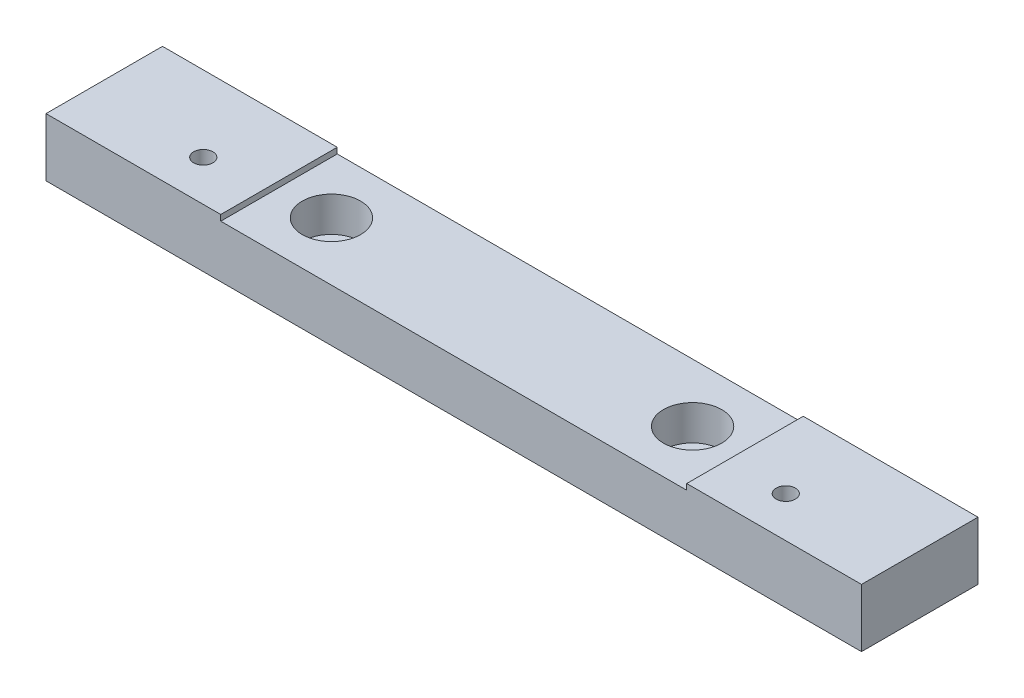
ISO-10303-21;
HEADER;
FILE_DESCRIPTION(('STEP AP214'),'2;1');
FILE_NAME('part.step','',(''),(''),'','','');
FILE_SCHEMA(('AUTOMOTIVE_DESIGN { 1 0 10303 214 1 1 1 1 }'));
ENDSEC;
DATA;
#1=APPLICATION_CONTEXT('core data for automotive mechanical design processes');
#2=APPLICATION_PROTOCOL_DEFINITION('international standard','automotive_design',2000,#1);
#3=PRODUCT_CONTEXT('',#1,'mechanical');
#4=PRODUCT('Part','Part','',(#3));
#5=PRODUCT_RELATED_PRODUCT_CATEGORY('part','',(#4));
#6=PRODUCT_DEFINITION_FORMATION('','',#4);
#7=PRODUCT_DEFINITION_CONTEXT('part definition',#1,'design');
#8=PRODUCT_DEFINITION('design','',#6,#7);
#9=PRODUCT_DEFINITION_SHAPE('','',#8);
#10=(LENGTH_UNIT() NAMED_UNIT(*) SI_UNIT(.MILLI.,.METRE.));
#11=(NAMED_UNIT(*) PLANE_ANGLE_UNIT() SI_UNIT($,.RADIAN.));
#12=(NAMED_UNIT(*) SI_UNIT($,.STERADIAN.) SOLID_ANGLE_UNIT());
#13=UNCERTAINTY_MEASURE_WITH_UNIT(LENGTH_MEASURE(1.E-05),#10,'distance_accuracy_value','');
#14=(GEOMETRIC_REPRESENTATION_CONTEXT(3) GLOBAL_UNCERTAINTY_ASSIGNED_CONTEXT((#13)) GLOBAL_UNIT_ASSIGNED_CONTEXT((#10,
#11,#12)) REPRESENTATION_CONTEXT('',''));
#15=CARTESIAN_POINT('',(0.,0.,0.));
#16=DIRECTION('',(0.,0.,1.));
#17=DIRECTION('',(1.,0.,0.));
#18=AXIS2_PLACEMENT_3D('',#15,#16,#17);
#19=CARTESIAN_POINT('',(-31.,0.,0.));
#20=DIRECTION('',(0.,1.,0.));
#21=DIRECTION('',(0.,0.,1.));
#22=AXIS2_PLACEMENT_3D('',#19,#20,#21);
#23=CYLINDRICAL_SURFACE('',#22,2.75);
#24=CARTESIAN_POINT('',(-31.,0.,0.));
#25=DIRECTION('',(0.,1.,0.));
#26=DIRECTION('',(0.,0.,1.));
#27=AXIS2_PLACEMENT_3D('',#24,#25,#26);
#28=CIRCLE('',#27,2.75);
#29=CARTESIAN_POINT('',(-31.,0.,2.75));
#30=VERTEX_POINT('',#29);
#31=EDGE_CURVE('E168',#30,#30,#28,.T.);
#32=ORIENTED_EDGE('',*,*,#31,.F.);
#33=EDGE_LOOP('',(#32));
#34=FACE_BOUND('',#33,.T.);
#35=CARTESIAN_POINT('',(-31.,3.,0.));
#36=DIRECTION('',(0.,1.,0.));
#37=DIRECTION('',(0.,0.,1.));
#38=AXIS2_PLACEMENT_3D('',#35,#36,#37);
#39=CIRCLE('',#38,2.75);
#40=CARTESIAN_POINT('',(-31.,3.,2.75));
#41=VERTEX_POINT('',#40);
#42=EDGE_CURVE('E37',#41,#41,#39,.F.);
#43=ORIENTED_EDGE('',*,*,#42,.F.);
#44=EDGE_LOOP('',(#43));
#45=FACE_BOUND('',#44,.T.);
#46=ADVANCED_FACE('F33',(#34,#45),#23,.F.);
#47=CARTESIAN_POINT('',(31.,0.,0.));
#48=DIRECTION('',(0.,1.,0.));
#49=DIRECTION('',(0.,0.,1.));
#50=AXIS2_PLACEMENT_3D('',#47,#48,#49);
#51=CYLINDRICAL_SURFACE('',#50,2.75);
#52=CARTESIAN_POINT('',(31.,0.,0.));
#53=DIRECTION('',(0.,1.,0.));
#54=DIRECTION('',(0.,0.,1.));
#55=AXIS2_PLACEMENT_3D('',#52,#53,#54);
#56=CIRCLE('',#55,2.75);
#57=CARTESIAN_POINT('',(31.,0.,2.75));
#58=VERTEX_POINT('',#57);
#59=EDGE_CURVE('E136',#58,#58,#56,.T.);
#60=ORIENTED_EDGE('',*,*,#59,.F.);
#61=EDGE_LOOP('',(#60));
#62=FACE_BOUND('',#61,.T.);
#63=CARTESIAN_POINT('',(31.,3.,0.));
#64=DIRECTION('',(0.,1.,0.));
#65=DIRECTION('',(0.,0.,1.));
#66=AXIS2_PLACEMENT_3D('',#63,#64,#65);
#67=CIRCLE('',#66,2.75);
#68=CARTESIAN_POINT('',(31.,3.,2.75));
#69=VERTEX_POINT('',#68);
#70=EDGE_CURVE('E166',#69,#69,#67,.F.);
#71=ORIENTED_EDGE('',*,*,#70,.F.);
#72=EDGE_LOOP('',(#71));
#73=FACE_BOUND('',#72,.T.);
#74=ADVANCED_FACE('F190',(#62,#73),#51,.F.);
#75=CARTESIAN_POINT('',(0.,10.,0.));
#76=DIRECTION('',(0.,1.,0.));
#77=DIRECTION('',(0.,0.,1.));
#78=AXIS2_PLACEMENT_3D('',#75,#76,#77);
#79=PLANE('',#78);
#80=CARTESIAN_POINT('',(-50.,10.,3.));
#81=DIRECTION('',(0.,1.,0.));
#82=DIRECTION('',(0.,0.,1.));
#83=AXIS2_PLACEMENT_3D('',#80,#81,#82);
#84=CIRCLE('',#83,1.65);
#85=CARTESIAN_POINT('',(-50.,10.,4.65));
#86=VERTEX_POINT('',#85);
#87=EDGE_CURVE('E378',#86,#86,#84,.T.);
#88=ORIENTED_EDGE('',*,*,#87,.F.);
#89=EDGE_LOOP('',(#88));
#90=FACE_BOUND('',#89,.T.);
#91=DIRECTION('',(0.,0.,1.));
#92=VECTOR('',#91,1.);
#93=CARTESIAN_POINT('',(-40.,10.,-10.));
#94=LINE('',#93,#92);
#95=CARTESIAN_POINT('',(-40.,10.,-10.));
#96=VERTEX_POINT('',#95);
#97=CARTESIAN_POINT('',(-40.,10.,10.));
#98=VERTEX_POINT('',#97);
#99=EDGE_CURVE('E114',#96,#98,#94,.T.);
#100=ORIENTED_EDGE('',*,*,#99,.F.);
#101=DIRECTION('',(-1.,0.,0.));
#102=VECTOR('',#101,1.);
#103=CARTESIAN_POINT('',(-70.,10.,-10.));
#104=LINE('',#103,#102);
#105=CARTESIAN_POINT('',(-70.,10.,-10.));
#106=VERTEX_POINT('',#105);
#107=EDGE_CURVE('E59',#96,#106,#104,.T.);
#108=ORIENTED_EDGE('',*,*,#107,.T.);
#109=DIRECTION('',(0.,0.,1.));
#110=VECTOR('',#109,1.);
#111=CARTESIAN_POINT('',(-70.,10.,-10.));
#112=LINE('',#111,#110);
#113=CARTESIAN_POINT('',(-70.,10.,10.));
#114=VERTEX_POINT('',#113);
#115=EDGE_CURVE('E145',#106,#114,#112,.T.);
#116=ORIENTED_EDGE('',*,*,#115,.T.);
#117=DIRECTION('',(1.,0.,0.));
#118=VECTOR('',#117,1.);
#119=CARTESIAN_POINT('',(-70.,10.,10.));
#120=LINE('',#119,#118);
#121=EDGE_CURVE('E88',#114,#98,#120,.T.);
#122=ORIENTED_EDGE('',*,*,#121,.T.);
#123=EDGE_LOOP('',(#100,#108,#116,#122));
#124=FACE_BOUND('',#123,.T.);
#125=ADVANCED_FACE('F193',(#90,#124),#79,.T.);
#126=CARTESIAN_POINT('',(-70.,10.,-10.));
#127=DIRECTION('',(1.,0.,0.));
#128=DIRECTION('',(0.,0.,-1.));
#129=AXIS2_PLACEMENT_3D('',#126,#127,#128);
#130=PLANE('',#129);
#131=DIRECTION('',(0.,0.,1.));
#132=VECTOR('',#131,1.);
#133=CARTESIAN_POINT('',(-70.,0.,-10.));
#134=LINE('',#133,#132);
#135=CARTESIAN_POINT('',(-70.,0.,-10.));
#136=VERTEX_POINT('',#135);
#137=CARTESIAN_POINT('',(-70.,0.,10.));
#138=VERTEX_POINT('',#137);
#139=EDGE_CURVE('E140',#136,#138,#134,.T.);
#140=ORIENTED_EDGE('',*,*,#139,.T.);
#141=DIRECTION('',(0.,-1.,0.));
#142=VECTOR('',#141,1.);
#143=CARTESIAN_POINT('',(-70.,10.,10.));
#144=LINE('',#143,#142);
#145=EDGE_CURVE('E11',#114,#138,#144,.T.);
#146=ORIENTED_EDGE('',*,*,#145,.F.);
#147=ORIENTED_EDGE('',*,*,#115,.F.);
#148=DIRECTION('',(0.,-1.,0.));
#149=VECTOR('',#148,1.);
#150=CARTESIAN_POINT('',(-70.,10.,-10.));
#151=LINE('',#150,#149);
#152=EDGE_CURVE('E154',#106,#136,#151,.T.);
#153=ORIENTED_EDGE('',*,*,#152,.T.);
#154=EDGE_LOOP('',(#140,#146,#147,#153));
#155=FACE_BOUND('',#154,.T.);
#156=ADVANCED_FACE('F35',(#155),#130,.F.);
#157=CARTESIAN_POINT('',(-70.,10.,10.));
#158=DIRECTION('',(0.,0.,-1.));
#159=DIRECTION('',(-1.,0.,0.));
#160=AXIS2_PLACEMENT_3D('',#157,#158,#159);
#161=PLANE('',#160);
#162=DIRECTION('',(1.,0.,0.));
#163=VECTOR('',#162,1.);
#164=CARTESIAN_POINT('',(-40.,9.,10.));
#165=LINE('',#164,#163);
#166=CARTESIAN_POINT('',(-40.,9.,10.));
#167=VERTEX_POINT('',#166);
#168=CARTESIAN_POINT('',(40.,9.,10.));
#169=VERTEX_POINT('',#168);
#170=EDGE_CURVE('E122',#167,#169,#165,.T.);
#171=ORIENTED_EDGE('',*,*,#170,.F.);
#172=DIRECTION('',(0.,1.,0.));
#173=VECTOR('',#172,1.);
#174=CARTESIAN_POINT('',(-40.,9.,10.));
#175=LINE('',#174,#173);
#176=EDGE_CURVE('E109',#167,#98,#175,.T.);
#177=ORIENTED_EDGE('',*,*,#176,.T.);
#178=ORIENTED_EDGE('',*,*,#121,.F.);
#179=ORIENTED_EDGE('',*,*,#145,.T.);
#180=DIRECTION('',(1.,0.,0.));
#181=VECTOR('',#180,1.);
#182=CARTESIAN_POINT('',(-70.,0.,10.));
#183=LINE('',#182,#181);
#184=CARTESIAN_POINT('',(70.,0.,10.));
#185=VERTEX_POINT('',#184);
#186=EDGE_CURVE('E157',#138,#185,#183,.T.);
#187=ORIENTED_EDGE('',*,*,#186,.T.);
#188=DIRECTION('',(0.,-1.,0.));
#189=VECTOR('',#188,1.);
#190=CARTESIAN_POINT('',(70.,10.,10.));
#191=LINE('',#190,#189);
#192=CARTESIAN_POINT('',(70.,10.,10.));
#193=VERTEX_POINT('',#192);
#194=EDGE_CURVE('E42',#193,#185,#191,.T.);
#195=ORIENTED_EDGE('',*,*,#194,.F.);
#196=CARTESIAN_POINT('',(40.,10.,10.));
#197=VERTEX_POINT('',#196);
#198=EDGE_CURVE('E147',#197,#193,#120,.T.);
#199=ORIENTED_EDGE('',*,*,#198,.F.);
#200=DIRECTION('',(0.,1.,0.));
#201=VECTOR('',#200,1.);
#202=CARTESIAN_POINT('',(40.,9.,10.));
#203=LINE('',#202,#201);
#204=EDGE_CURVE('E50',#169,#197,#203,.T.);
#205=ORIENTED_EDGE('',*,*,#204,.F.);
#206=EDGE_LOOP('',(#171,#177,#178,#179,#187,#195,#199,#205));
#207=FACE_BOUND('',#206,.T.);
#208=ADVANCED_FACE('F127',(#207),#161,.F.);
#209=CARTESIAN_POINT('',(70.,10.,-10.));
#210=DIRECTION('',(-1.,0.,0.));
#211=DIRECTION('',(0.,0.,1.));
#212=AXIS2_PLACEMENT_3D('',#209,#210,#211);
#213=PLANE('',#212);
#214=DIRECTION('',(0.,0.,-1.));
#215=VECTOR('',#214,1.);
#216=CARTESIAN_POINT('',(70.,0.,-10.));
#217=LINE('',#216,#215);
#218=CARTESIAN_POINT('',(70.,0.,-10.));
#219=VERTEX_POINT('',#218);
#220=EDGE_CURVE('E159',#185,#219,#217,.T.);
#221=ORIENTED_EDGE('',*,*,#220,.T.);
#222=DIRECTION('',(0.,-1.,0.));
#223=VECTOR('',#222,1.);
#224=CARTESIAN_POINT('',(70.,10.,-10.));
#225=LINE('',#224,#223);
#226=CARTESIAN_POINT('',(70.,10.,-10.));
#227=VERTEX_POINT('',#226);
#228=EDGE_CURVE('E163',#227,#219,#225,.T.);
#229=ORIENTED_EDGE('',*,*,#228,.F.);
#230=DIRECTION('',(0.,0.,-1.));
#231=VECTOR('',#230,1.);
#232=CARTESIAN_POINT('',(70.,10.,-10.));
#233=LINE('',#232,#231);
#234=EDGE_CURVE('E149',#193,#227,#233,.T.);
#235=ORIENTED_EDGE('',*,*,#234,.F.);
#236=ORIENTED_EDGE('',*,*,#194,.T.);
#237=EDGE_LOOP('',(#221,#229,#235,#236));
#238=FACE_BOUND('',#237,.T.);
#239=ADVANCED_FACE('F223',(#238),#213,.F.);
#240=CARTESIAN_POINT('',(-70.,10.,-10.));
#241=DIRECTION('',(0.,0.,1.));
#242=DIRECTION('',(1.,0.,0.));
#243=AXIS2_PLACEMENT_3D('',#240,#241,#242);
#244=PLANE('',#243);
#245=ORIENTED_EDGE('',*,*,#107,.F.);
#246=DIRECTION('',(0.,1.,0.));
#247=VECTOR('',#246,1.);
#248=CARTESIAN_POINT('',(-40.,9.,-10.));
#249=LINE('',#248,#247);
#250=CARTESIAN_POINT('',(-40.,9.,-10.));
#251=VERTEX_POINT('',#250);
#252=EDGE_CURVE('E138',#251,#96,#249,.T.);
#253=ORIENTED_EDGE('',*,*,#252,.F.);
#254=DIRECTION('',(-1.,0.,0.));
#255=VECTOR('',#254,1.);
#256=CARTESIAN_POINT('',(-40.,9.,-10.));
#257=LINE('',#256,#255);
#258=CARTESIAN_POINT('',(40.,9.,-10.));
#259=VERTEX_POINT('',#258);
#260=EDGE_CURVE('E116',#259,#251,#257,.T.);
#261=ORIENTED_EDGE('',*,*,#260,.F.);
#262=DIRECTION('',(0.,1.,0.));
#263=VECTOR('',#262,1.);
#264=CARTESIAN_POINT('',(40.,9.,-10.));
#265=LINE('',#264,#263);
#266=CARTESIAN_POINT('',(40.,10.,-10.));
#267=VERTEX_POINT('',#266);
#268=EDGE_CURVE('E141',#259,#267,#265,.T.);
#269=ORIENTED_EDGE('',*,*,#268,.T.);
#270=EDGE_CURVE('E151',#227,#267,#104,.T.);
#271=ORIENTED_EDGE('',*,*,#270,.F.);
#272=ORIENTED_EDGE('',*,*,#228,.T.);
#273=DIRECTION('',(-1.,0.,0.));
#274=VECTOR('',#273,1.);
#275=CARTESIAN_POINT('',(-70.,0.,-10.));
#276=LINE('',#275,#274);
#277=EDGE_CURVE('E81',#219,#136,#276,.T.);
#278=ORIENTED_EDGE('',*,*,#277,.T.);
#279=ORIENTED_EDGE('',*,*,#152,.F.);
#280=EDGE_LOOP('',(#245,#253,#261,#269,#271,#272,#278,#279));
#281=FACE_BOUND('',#280,.T.);
#282=ADVANCED_FACE('F216',(#281),#244,.F.);
#283=CARTESIAN_POINT('',(50.,10.,3.));
#284=DIRECTION('',(0.,1.,0.));
#285=DIRECTION('',(0.,0.,1.));
#286=AXIS2_PLACEMENT_3D('',#283,#284,#285);
#287=CIRCLE('',#286,1.65);
#288=CARTESIAN_POINT('',(50.,10.,4.65));
#289=VERTEX_POINT('',#288);
#290=EDGE_CURVE('E386',#289,#289,#287,.T.);
#291=ORIENTED_EDGE('',*,*,#290,.F.);
#292=EDGE_LOOP('',(#291));
#293=FACE_BOUND('',#292,.T.);
#294=DIRECTION('',(0.,0.,-1.));
#295=VECTOR('',#294,1.);
#296=CARTESIAN_POINT('',(40.,10.,-10.));
#297=LINE('',#296,#295);
#298=EDGE_CURVE('E125',#197,#267,#297,.T.);
#299=ORIENTED_EDGE('',*,*,#298,.F.);
#300=ORIENTED_EDGE('',*,*,#198,.T.);
#301=ORIENTED_EDGE('',*,*,#234,.T.);
#302=ORIENTED_EDGE('',*,*,#270,.T.);
#303=EDGE_LOOP('',(#299,#300,#301,#302));
#304=FACE_BOUND('',#303,.T.);
#305=ADVANCED_FACE('F201',(#293,#304),#79,.T.);
#306=CARTESIAN_POINT('',(0.,0.,0.));
#307=DIRECTION('',(0.,1.,0.));
#308=DIRECTION('',(0.,0.,1.));
#309=AXIS2_PLACEMENT_3D('',#306,#307,#308);
#310=PLANE('',#309);
#311=CARTESIAN_POINT('',(50.,0.,3.));
#312=DIRECTION('',(0.,1.,0.));
#313=DIRECTION('',(0.,0.,1.));
#314=AXIS2_PLACEMENT_3D('',#311,#312,#313);
#315=CIRCLE('',#314,1.65);
#316=CARTESIAN_POINT('',(50.,0.,4.65));
#317=VERTEX_POINT('',#316);
#318=EDGE_CURVE('E383',#317,#317,#315,.T.);
#319=ORIENTED_EDGE('',*,*,#318,.T.);
#320=EDGE_LOOP('',(#319));
#321=FACE_BOUND('',#320,.T.);
#322=CARTESIAN_POINT('',(-50.,0.,3.));
#323=DIRECTION('',(0.,1.,0.));
#324=DIRECTION('',(0.,0.,1.));
#325=AXIS2_PLACEMENT_3D('',#322,#323,#324);
#326=CIRCLE('',#325,1.65);
#327=CARTESIAN_POINT('',(-50.,0.,4.65));
#328=VERTEX_POINT('',#327);
#329=EDGE_CURVE('E376',#328,#328,#326,.T.);
#330=ORIENTED_EDGE('',*,*,#329,.T.);
#331=EDGE_LOOP('',(#330));
#332=FACE_BOUND('',#331,.T.);
#333=ORIENTED_EDGE('',*,*,#31,.T.);
#334=EDGE_LOOP('',(#333));
#335=FACE_BOUND('',#334,.T.);
#336=ORIENTED_EDGE('',*,*,#59,.T.);
#337=EDGE_LOOP('',(#336));
#338=FACE_BOUND('',#337,.T.);
#339=ORIENTED_EDGE('',*,*,#139,.F.);
#340=ORIENTED_EDGE('',*,*,#277,.F.);
#341=ORIENTED_EDGE('',*,*,#220,.F.);
#342=ORIENTED_EDGE('',*,*,#186,.F.);
#343=EDGE_LOOP('',(#339,#340,#341,#342));
#344=FACE_BOUND('',#343,.T.);
#345=ADVANCED_FACE('F187',(#321,#332,#335,#338,#344),#310,.F.);
#346=CARTESIAN_POINT('',(-40.,9.,-10.));
#347=DIRECTION('',(-1.,0.,0.));
#348=DIRECTION('',(0.,0.,1.));
#349=AXIS2_PLACEMENT_3D('',#346,#347,#348);
#350=PLANE('',#349);
#351=ORIENTED_EDGE('',*,*,#99,.T.);
#352=ORIENTED_EDGE('',*,*,#176,.F.);
#353=DIRECTION('',(0.,0.,1.));
#354=VECTOR('',#353,1.);
#355=CARTESIAN_POINT('',(-40.,9.,-10.));
#356=LINE('',#355,#354);
#357=EDGE_CURVE('E112',#251,#167,#356,.T.);
#358=ORIENTED_EDGE('',*,*,#357,.F.);
#359=ORIENTED_EDGE('',*,*,#252,.T.);
#360=EDGE_LOOP('',(#351,#352,#358,#359));
#361=FACE_BOUND('',#360,.T.);
#362=ADVANCED_FACE('F111',(#361),#350,.F.);
#363=CARTESIAN_POINT('',(40.,9.,-10.));
#364=DIRECTION('',(1.,0.,0.));
#365=DIRECTION('',(0.,0.,-1.));
#366=AXIS2_PLACEMENT_3D('',#363,#364,#365);
#367=PLANE('',#366);
#368=ORIENTED_EDGE('',*,*,#298,.T.);
#369=ORIENTED_EDGE('',*,*,#268,.F.);
#370=DIRECTION('',(0.,0.,-1.));
#371=VECTOR('',#370,1.);
#372=CARTESIAN_POINT('',(40.,9.,-10.));
#373=LINE('',#372,#371);
#374=EDGE_CURVE('E129',#169,#259,#373,.T.);
#375=ORIENTED_EDGE('',*,*,#374,.F.);
#376=ORIENTED_EDGE('',*,*,#204,.T.);
#377=EDGE_LOOP('',(#368,#369,#375,#376));
#378=FACE_BOUND('',#377,.T.);
#379=ADVANCED_FACE('F209',(#378),#367,.F.);
#380=CARTESIAN_POINT('',(0.,9.,0.));
#381=DIRECTION('',(0.,1.,0.));
#382=DIRECTION('',(0.,0.,1.));
#383=AXIS2_PLACEMENT_3D('',#380,#381,#382);
#384=PLANE('',#383);
#385=CARTESIAN_POINT('',(-31.,9.,0.));
#386=DIRECTION('',(0.,1.,0.));
#387=DIRECTION('',(0.,0.,1.));
#388=AXIS2_PLACEMENT_3D('',#385,#386,#387);
#389=CIRCLE('',#388,5.);
#390=CARTESIAN_POINT('',(-31.,9.,5.));
#391=VERTEX_POINT('',#390);
#392=EDGE_CURVE('E182',#391,#391,#389,.T.);
#393=ORIENTED_EDGE('',*,*,#392,.F.);
#394=EDGE_LOOP('',(#393));
#395=FACE_BOUND('',#394,.T.);
#396=CARTESIAN_POINT('',(31.,9.,0.));
#397=DIRECTION('',(0.,1.,0.));
#398=DIRECTION('',(0.,0.,1.));
#399=AXIS2_PLACEMENT_3D('',#396,#397,#398);
#400=CIRCLE('',#399,5.);
#401=CARTESIAN_POINT('',(31.,9.,5.));
#402=VERTEX_POINT('',#401);
#403=EDGE_CURVE('E175',#402,#402,#400,.T.);
#404=ORIENTED_EDGE('',*,*,#403,.F.);
#405=EDGE_LOOP('',(#404));
#406=FACE_BOUND('',#405,.T.);
#407=ORIENTED_EDGE('',*,*,#357,.T.);
#408=ORIENTED_EDGE('',*,*,#170,.T.);
#409=ORIENTED_EDGE('',*,*,#374,.T.);
#410=ORIENTED_EDGE('',*,*,#260,.T.);
#411=EDGE_LOOP('',(#407,#408,#409,#410));
#412=FACE_BOUND('',#411,.T.);
#413=ADVANCED_FACE('F120',(#395,#406,#412),#384,.T.);
#414=CARTESIAN_POINT('',(31.,3.,0.));
#415=DIRECTION('',(0.,1.,0.));
#416=DIRECTION('',(0.,0.,1.));
#417=AXIS2_PLACEMENT_3D('',#414,#415,#416);
#418=PLANE('',#417);
#419=CARTESIAN_POINT('',(31.,3.,0.));
#420=DIRECTION('',(0.,1.,0.));
#421=DIRECTION('',(0.,0.,1.));
#422=AXIS2_PLACEMENT_3D('',#419,#420,#421);
#423=CIRCLE('',#422,5.);
#424=CARTESIAN_POINT('',(31.,3.,5.));
#425=VERTEX_POINT('',#424);
#426=EDGE_CURVE('E169',#425,#425,#423,.T.);
#427=ORIENTED_EDGE('',*,*,#426,.T.);
#428=EDGE_LOOP('',(#427));
#429=FACE_BOUND('',#428,.T.);
#430=ORIENTED_EDGE('',*,*,#70,.T.);
#431=EDGE_LOOP('',(#430));
#432=FACE_BOUND('',#431,.T.);
#433=ADVANCED_FACE('F208',(#429,#432),#418,.T.);
#434=CARTESIAN_POINT('',(31.,3.,0.));
#435=DIRECTION('',(0.,1.,0.));
#436=DIRECTION('',(0.,0.,1.));
#437=AXIS2_PLACEMENT_3D('',#434,#435,#436);
#438=CYLINDRICAL_SURFACE('',#437,5.);
#439=ORIENTED_EDGE('',*,*,#426,.F.);
#440=EDGE_LOOP('',(#439));
#441=FACE_BOUND('',#440,.T.);
#442=ORIENTED_EDGE('',*,*,#403,.T.);
#443=EDGE_LOOP('',(#442));
#444=FACE_BOUND('',#443,.T.);
#445=ADVANCED_FACE('F297',(#441,#444),#438,.F.);
#446=CARTESIAN_POINT('',(-31.,3.,0.));
#447=DIRECTION('',(0.,1.,0.));
#448=DIRECTION('',(0.,0.,1.));
#449=AXIS2_PLACEMENT_3D('',#446,#447,#448);
#450=PLANE('',#449);
#451=CARTESIAN_POINT('',(-31.,3.,0.));
#452=DIRECTION('',(0.,1.,0.));
#453=DIRECTION('',(0.,0.,1.));
#454=AXIS2_PLACEMENT_3D('',#451,#452,#453);
#455=CIRCLE('',#454,5.);
#456=CARTESIAN_POINT('',(-31.,3.,5.));
#457=VERTEX_POINT('',#456);
#458=EDGE_CURVE('E373',#457,#457,#455,.T.);
#459=ORIENTED_EDGE('',*,*,#458,.T.);
#460=EDGE_LOOP('',(#459));
#461=FACE_BOUND('',#460,.T.);
#462=ORIENTED_EDGE('',*,*,#42,.T.);
#463=EDGE_LOOP('',(#462));
#464=FACE_BOUND('',#463,.T.);
#465=ADVANCED_FACE('F294',(#461,#464),#450,.T.);
#466=CARTESIAN_POINT('',(-31.,3.,0.));
#467=DIRECTION('',(0.,1.,0.));
#468=DIRECTION('',(0.,0.,1.));
#469=AXIS2_PLACEMENT_3D('',#466,#467,#468);
#470=CYLINDRICAL_SURFACE('',#469,5.);
#471=ORIENTED_EDGE('',*,*,#458,.F.);
#472=EDGE_LOOP('',(#471));
#473=FACE_BOUND('',#472,.T.);
#474=ORIENTED_EDGE('',*,*,#392,.T.);
#475=EDGE_LOOP('',(#474));
#476=FACE_BOUND('',#475,.T.);
#477=ADVANCED_FACE('F255',(#473,#476),#470,.F.);
#478=CARTESIAN_POINT('',(-50.,0.,3.));
#479=DIRECTION('',(0.,1.,0.));
#480=DIRECTION('',(0.,0.,1.));
#481=AXIS2_PLACEMENT_3D('',#478,#479,#480);
#482=CYLINDRICAL_SURFACE('',#481,1.65);
#483=ORIENTED_EDGE('',*,*,#329,.F.);
#484=EDGE_LOOP('',(#483));
#485=FACE_BOUND('',#484,.T.);
#486=ORIENTED_EDGE('',*,*,#87,.T.);
#487=EDGE_LOOP('',(#486));
#488=FACE_BOUND('',#487,.T.);
#489=ADVANCED_FACE('F272',(#485,#488),#482,.F.);
#490=CARTESIAN_POINT('',(50.,0.,3.));
#491=DIRECTION('',(0.,1.,0.));
#492=DIRECTION('',(0.,0.,1.));
#493=AXIS2_PLACEMENT_3D('',#490,#491,#492);
#494=CYLINDRICAL_SURFACE('',#493,1.65);
#495=ORIENTED_EDGE('',*,*,#318,.F.);
#496=EDGE_LOOP('',(#495));
#497=FACE_BOUND('',#496,.T.);
#498=ORIENTED_EDGE('',*,*,#290,.T.);
#499=EDGE_LOOP('',(#498));
#500=FACE_BOUND('',#499,.T.);
#501=ADVANCED_FACE('F277',(#497,#500),#494,.F.);
#502=CLOSED_SHELL('',(#46,#74,#125,#156,#208,#239,#282,#305,#345,#362,#379,#413,#433,#445,#465,
#477,#489,#501));
#503=MANIFOLD_SOLID_BREP('B2',#502);
#504=ADVANCED_BREP_SHAPE_REPRESENTATION('',(#18,#503),#14);
#505=SHAPE_DEFINITION_REPRESENTATION(#9,#504);
ENDSEC;
END-ISO-10303-21;
